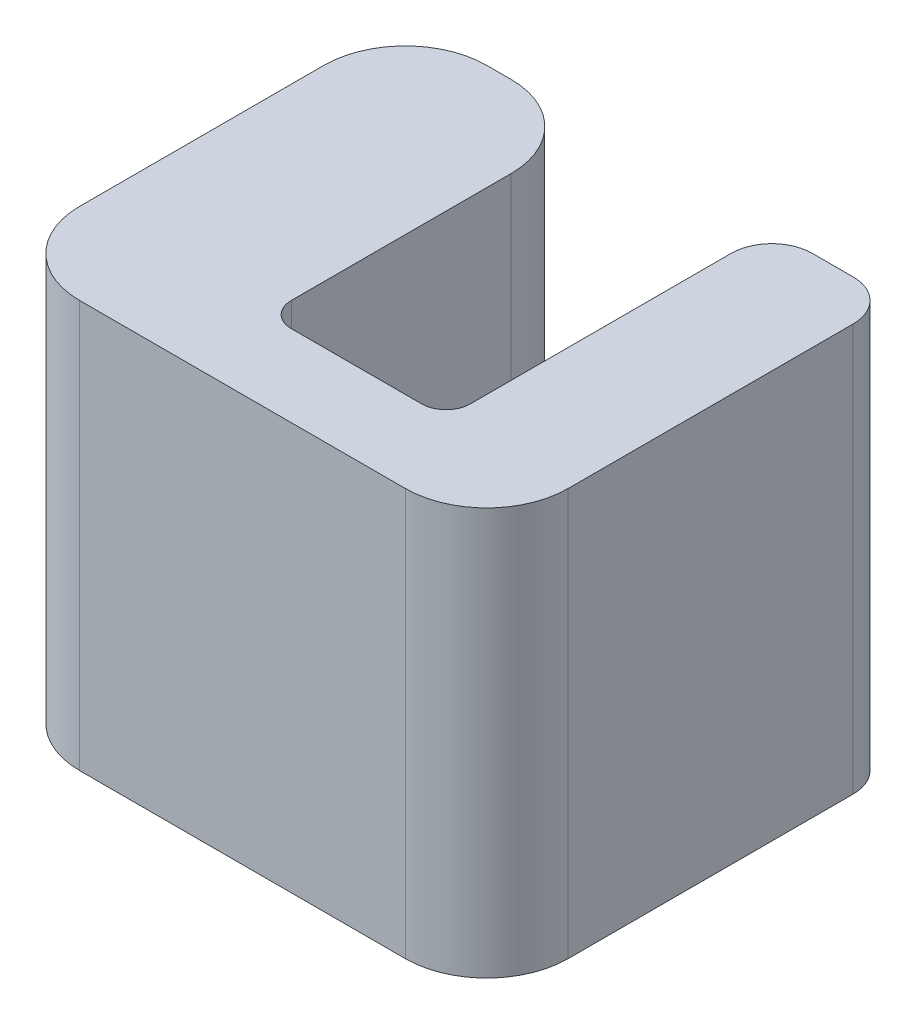
ISO-10303-21;
HEADER;
FILE_DESCRIPTION(('STEP AP214'),'2;1');
FILE_NAME('part.step','',(''),(''),'','','');
FILE_SCHEMA(('AUTOMOTIVE_DESIGN { 1 0 10303 214 1 1 1 1 }'));
ENDSEC;
DATA;
#1=APPLICATION_CONTEXT('core data for automotive mechanical design processes');
#2=APPLICATION_PROTOCOL_DEFINITION('international standard','automotive_design',2000,#1);
#3=PRODUCT_CONTEXT('',#1,'mechanical');
#4=PRODUCT('Part','Part','',(#3));
#5=PRODUCT_RELATED_PRODUCT_CATEGORY('part','',(#4));
#6=PRODUCT_DEFINITION_FORMATION('','',#4);
#7=PRODUCT_DEFINITION_CONTEXT('part definition',#1,'design');
#8=PRODUCT_DEFINITION('design','',#6,#7);
#9=PRODUCT_DEFINITION_SHAPE('','',#8);
#10=(LENGTH_UNIT() NAMED_UNIT(*) SI_UNIT(.MILLI.,.METRE.));
#11=(NAMED_UNIT(*) PLANE_ANGLE_UNIT() SI_UNIT($,.RADIAN.));
#12=(NAMED_UNIT(*) SI_UNIT($,.STERADIAN.) SOLID_ANGLE_UNIT());
#13=UNCERTAINTY_MEASURE_WITH_UNIT(LENGTH_MEASURE(1.E-05),#10,'distance_accuracy_value','');
#14=(GEOMETRIC_REPRESENTATION_CONTEXT(3) GLOBAL_UNCERTAINTY_ASSIGNED_CONTEXT((#13)) GLOBAL_UNIT_ASSIGNED_CONTEXT((#10,
#11,#12)) REPRESENTATION_CONTEXT('',''));
#15=CARTESIAN_POINT('',(0.,0.,0.));
#16=DIRECTION('',(0.,0.,1.));
#17=DIRECTION('',(1.,0.,0.));
#18=AXIS2_PLACEMENT_3D('',#15,#16,#17);
#19=CARTESIAN_POINT('',(-0.4,0.,1.2));
#20=DIRECTION('',(0.,1.,0.));
#21=DIRECTION('',(0.,0.,1.));
#22=AXIS2_PLACEMENT_3D('',#19,#20,#21);
#23=CYLINDRICAL_SURFACE('',#22,0.3);
#24=DIRECTION('',(0.,-1.,0.));
#25=VECTOR('',#24,1.);
#26=CARTESIAN_POINT('',(-0.7,0.,1.2));
#27=LINE('',#26,#25);
#28=CARTESIAN_POINT('',(-0.7,5.,1.2));
#29=VERTEX_POINT('',#28);
#30=CARTESIAN_POINT('',(-0.7,0.,1.2));
#31=VERTEX_POINT('',#30);
#32=EDGE_CURVE('E247',#29,#31,#27,.T.);
#33=ORIENTED_EDGE('',*,*,#32,.F.);
#34=CARTESIAN_POINT('',(-0.4,5.,1.2));
#35=DIRECTION('',(0.,-1.,0.));
#36=DIRECTION('',(0.,0.,-1.));
#37=AXIS2_PLACEMENT_3D('',#34,#35,#36);
#38=CIRCLE('',#37,0.3);
#39=CARTESIAN_POINT('',(-0.4,5.,1.5));
#40=VERTEX_POINT('',#39);
#41=EDGE_CURVE('E40',#29,#40,#38,.F.);
#42=ORIENTED_EDGE('',*,*,#41,.T.);
#43=DIRECTION('',(0.,-1.,0.));
#44=VECTOR('',#43,1.);
#45=CARTESIAN_POINT('',(-0.4,0.,1.5));
#46=LINE('',#45,#44);
#47=CARTESIAN_POINT('',(-0.4,0.,1.5));
#48=VERTEX_POINT('',#47);
#49=EDGE_CURVE('E250',#48,#40,#46,.F.);
#50=ORIENTED_EDGE('',*,*,#49,.F.);
#51=CARTESIAN_POINT('',(-0.4,0.,1.2));
#52=DIRECTION('',(0.,-1.,0.));
#53=DIRECTION('',(0.,0.,-1.));
#54=AXIS2_PLACEMENT_3D('',#51,#52,#53);
#55=CIRCLE('',#54,0.3);
#56=EDGE_CURVE('E11',#48,#31,#55,.T.);
#57=ORIENTED_EDGE('',*,*,#56,.T.);
#58=EDGE_LOOP('',(#33,#42,#50,#57));
#59=FACE_BOUND('',#58,.T.);
#60=ADVANCED_FACE('F33',(#59),#23,.F.);
#61=CARTESIAN_POINT('',(1.2,0.,1.2));
#62=DIRECTION('',(0.,1.,0.));
#63=DIRECTION('',(0.,0.,1.));
#64=AXIS2_PLACEMENT_3D('',#61,#62,#63);
#65=CYLINDRICAL_SURFACE('',#64,0.3);
#66=DIRECTION('',(0.,-1.,0.));
#67=VECTOR('',#66,1.);
#68=CARTESIAN_POINT('',(1.2,0.,1.5));
#69=LINE('',#68,#67);
#70=CARTESIAN_POINT('',(1.2,5.,1.5));
#71=VERTEX_POINT('',#70);
#72=CARTESIAN_POINT('',(1.2,0.,1.5));
#73=VERTEX_POINT('',#72);
#74=EDGE_CURVE('E236',#71,#73,#69,.T.);
#75=ORIENTED_EDGE('',*,*,#74,.F.);
#76=CARTESIAN_POINT('',(1.2,5.,1.2));
#77=DIRECTION('',(0.,-1.,0.));
#78=DIRECTION('',(0.,0.,-1.));
#79=AXIS2_PLACEMENT_3D('',#76,#77,#78);
#80=CIRCLE('',#79,0.3);
#81=CARTESIAN_POINT('',(1.5,5.,1.2));
#82=VERTEX_POINT('',#81);
#83=EDGE_CURVE('E242',#71,#82,#80,.F.);
#84=ORIENTED_EDGE('',*,*,#83,.T.);
#85=DIRECTION('',(0.,-1.,0.));
#86=VECTOR('',#85,1.);
#87=CARTESIAN_POINT('',(1.5,0.,1.2));
#88=LINE('',#87,#86);
#89=CARTESIAN_POINT('',(1.5,0.,1.2));
#90=VERTEX_POINT('',#89);
#91=EDGE_CURVE('E239',#90,#82,#88,.F.);
#92=ORIENTED_EDGE('',*,*,#91,.F.);
#93=CARTESIAN_POINT('',(1.2,0.,1.2));
#94=DIRECTION('',(0.,-1.,0.));
#95=DIRECTION('',(0.,0.,-1.));
#96=AXIS2_PLACEMENT_3D('',#93,#94,#95);
#97=CIRCLE('',#96,0.3);
#98=EDGE_CURVE('E244',#90,#73,#97,.T.);
#99=ORIENTED_EDGE('',*,*,#98,.T.);
#100=EDGE_LOOP('',(#75,#84,#92,#99));
#101=FACE_BOUND('',#100,.T.);
#102=ADVANCED_FACE('F306',(#101),#65,.F.);
#103=CARTESIAN_POINT('',(2.5,5.,-2.));
#104=DIRECTION('',(0.,-1.,0.));
#105=DIRECTION('',(0.,0.,-1.));
#106=AXIS2_PLACEMENT_3D('',#103,#104,#105);
#107=CYLINDRICAL_SURFACE('',#106,0.5);
#108=DIRECTION('',(0.,-1.,0.));
#109=VECTOR('',#108,1.);
#110=CARTESIAN_POINT('',(2.5,5.,-2.5));
#111=LINE('',#110,#109);
#112=CARTESIAN_POINT('',(2.5,5.,-2.5));
#113=VERTEX_POINT('',#112);
#114=CARTESIAN_POINT('',(2.5,0.,-2.5));
#115=VERTEX_POINT('',#114);
#116=EDGE_CURVE('E228',#113,#115,#111,.T.);
#117=ORIENTED_EDGE('',*,*,#116,.F.);
#118=CARTESIAN_POINT('',(2.5,5.,-2.));
#119=DIRECTION('',(0.,-1.,0.));
#120=DIRECTION('',(0.,0.,-1.));
#121=AXIS2_PLACEMENT_3D('',#118,#119,#120);
#122=CIRCLE('',#121,0.5);
#123=CARTESIAN_POINT('',(3.,5.,-2.));
#124=VERTEX_POINT('',#123);
#125=EDGE_CURVE('E233',#124,#113,#122,.F.);
#126=ORIENTED_EDGE('',*,*,#125,.F.);
#127=DIRECTION('',(0.,-1.,0.));
#128=VECTOR('',#127,1.);
#129=CARTESIAN_POINT('',(3.,5.,-2.));
#130=LINE('',#129,#128);
#131=CARTESIAN_POINT('',(3.,0.,-2.));
#132=VERTEX_POINT('',#131);
#133=EDGE_CURVE('E231',#132,#124,#130,.F.);
#134=ORIENTED_EDGE('',*,*,#133,.F.);
#135=CARTESIAN_POINT('',(2.5,0.,-2.));
#136=DIRECTION('',(0.,-1.,0.));
#137=DIRECTION('',(0.,0.,-1.));
#138=AXIS2_PLACEMENT_3D('',#135,#136,#137);
#139=CIRCLE('',#138,0.5);
#140=EDGE_CURVE('E167',#115,#132,#139,.T.);
#141=ORIENTED_EDGE('',*,*,#140,.F.);
#142=EDGE_LOOP('',(#117,#126,#134,#141));
#143=FACE_BOUND('',#142,.T.);
#144=ADVANCED_FACE('F321',(#143),#107,.T.);
#145=CARTESIAN_POINT('',(2.,5.,-2.));
#146=DIRECTION('',(0.,1.,0.));
#147=DIRECTION('',(0.,0.,1.));
#148=AXIS2_PLACEMENT_3D('',#145,#146,#147);
#149=CYLINDRICAL_SURFACE('',#148,0.5);
#150=DIRECTION('',(0.,1.,0.));
#151=VECTOR('',#150,1.);
#152=CARTESIAN_POINT('',(2.,5.,-2.5));
#153=LINE('',#152,#151);
#154=CARTESIAN_POINT('',(2.,0.,-2.5));
#155=VERTEX_POINT('',#154);
#156=CARTESIAN_POINT('',(2.,5.,-2.5));
#157=VERTEX_POINT('',#156);
#158=EDGE_CURVE('E216',#155,#157,#153,.T.);
#159=ORIENTED_EDGE('',*,*,#158,.F.);
#160=CARTESIAN_POINT('',(2.,0.,-2.));
#161=DIRECTION('',(0.,-1.,0.));
#162=DIRECTION('',(0.,0.,-1.));
#163=AXIS2_PLACEMENT_3D('',#160,#161,#162);
#164=CIRCLE('',#163,0.5);
#165=CARTESIAN_POINT('',(1.5,0.,-2.));
#166=VERTEX_POINT('',#165);
#167=EDGE_CURVE('E222',#166,#155,#164,.T.);
#168=ORIENTED_EDGE('',*,*,#167,.F.);
#169=DIRECTION('',(0.,1.,0.));
#170=VECTOR('',#169,1.);
#171=CARTESIAN_POINT('',(1.5,0.,-2.));
#172=LINE('',#171,#170);
#173=CARTESIAN_POINT('',(1.5,5.,-2.));
#174=VERTEX_POINT('',#173);
#175=EDGE_CURVE('E219',#174,#166,#172,.F.);
#176=ORIENTED_EDGE('',*,*,#175,.F.);
#177=CARTESIAN_POINT('',(2.,5.,-2.));
#178=DIRECTION('',(0.,-1.,0.));
#179=DIRECTION('',(0.,0.,-1.));
#180=AXIS2_PLACEMENT_3D('',#177,#178,#179);
#181=CIRCLE('',#180,0.5);
#182=EDGE_CURVE('E225',#157,#174,#181,.F.);
#183=ORIENTED_EDGE('',*,*,#182,.F.);
#184=EDGE_LOOP('',(#159,#168,#176,#183));
#185=FACE_BOUND('',#184,.T.);
#186=ADVANCED_FACE('F314',(#185),#149,.T.);
#187=CARTESIAN_POINT('',(-1.7,5.,-1.5));
#188=DIRECTION('',(0.,-1.,0.));
#189=DIRECTION('',(0.,0.,-1.));
#190=AXIS2_PLACEMENT_3D('',#187,#188,#189);
#191=CYLINDRICAL_SURFACE('',#190,1.);
#192=DIRECTION('',(0.,-1.,0.));
#193=VECTOR('',#192,1.);
#194=CARTESIAN_POINT('',(-1.7,5.,-2.5));
#195=LINE('',#194,#193);
#196=CARTESIAN_POINT('',(-1.7,5.,-2.5));
#197=VERTEX_POINT('',#196);
#198=CARTESIAN_POINT('',(-1.7,0.,-2.5));
#199=VERTEX_POINT('',#198);
#200=EDGE_CURVE('E206',#197,#199,#195,.T.);
#201=ORIENTED_EDGE('',*,*,#200,.F.);
#202=CARTESIAN_POINT('',(-1.7,5.,-1.5));
#203=DIRECTION('',(0.,-1.,0.));
#204=DIRECTION('',(0.,0.,-1.));
#205=AXIS2_PLACEMENT_3D('',#202,#203,#204);
#206=CIRCLE('',#205,1.);
#207=CARTESIAN_POINT('',(-0.7,5.,-1.5));
#208=VERTEX_POINT('',#207);
#209=EDGE_CURVE('E212',#208,#197,#206,.F.);
#210=ORIENTED_EDGE('',*,*,#209,.F.);
#211=DIRECTION('',(0.,-1.,0.));
#212=VECTOR('',#211,1.);
#213=CARTESIAN_POINT('',(-0.7,0.,-1.5));
#214=LINE('',#213,#212);
#215=CARTESIAN_POINT('',(-0.7,0.,-1.5));
#216=VERTEX_POINT('',#215);
#217=EDGE_CURVE('E209',#216,#208,#214,.F.);
#218=ORIENTED_EDGE('',*,*,#217,.F.);
#219=CARTESIAN_POINT('',(-1.7,0.,-1.5));
#220=DIRECTION('',(0.,-1.,0.));
#221=DIRECTION('',(0.,0.,-1.));
#222=AXIS2_PLACEMENT_3D('',#219,#220,#221);
#223=CIRCLE('',#222,1.);
#224=EDGE_CURVE('E214',#199,#216,#223,.T.);
#225=ORIENTED_EDGE('',*,*,#224,.F.);
#226=EDGE_LOOP('',(#201,#210,#218,#225));
#227=FACE_BOUND('',#226,.T.);
#228=ADVANCED_FACE('F298',(#227),#191,.T.);
#229=CARTESIAN_POINT('',(-2.,5.,-1.5));
#230=DIRECTION('',(0.,1.,0.));
#231=DIRECTION('',(0.,0.,1.));
#232=AXIS2_PLACEMENT_3D('',#229,#230,#231);
#233=CYLINDRICAL_SURFACE('',#232,1.);
#234=DIRECTION('',(0.,1.,0.));
#235=VECTOR('',#234,1.);
#236=CARTESIAN_POINT('',(-2.,5.,-2.5));
#237=LINE('',#236,#235);
#238=CARTESIAN_POINT('',(-2.,0.,-2.5));
#239=VERTEX_POINT('',#238);
#240=CARTESIAN_POINT('',(-2.,5.,-2.5));
#241=VERTEX_POINT('',#240);
#242=EDGE_CURVE('E195',#239,#241,#237,.T.);
#243=ORIENTED_EDGE('',*,*,#242,.F.);
#244=CARTESIAN_POINT('',(-2.,0.,-1.5));
#245=DIRECTION('',(0.,-1.,0.));
#246=DIRECTION('',(0.,0.,-1.));
#247=AXIS2_PLACEMENT_3D('',#244,#245,#246);
#248=CIRCLE('',#247,1.);
#249=CARTESIAN_POINT('',(-3.,0.,-1.5));
#250=VERTEX_POINT('',#249);
#251=EDGE_CURVE('E201',#250,#239,#248,.T.);
#252=ORIENTED_EDGE('',*,*,#251,.F.);
#253=DIRECTION('',(0.,1.,0.));
#254=VECTOR('',#253,1.);
#255=CARTESIAN_POINT('',(-3.,5.,-1.5));
#256=LINE('',#255,#254);
#257=CARTESIAN_POINT('',(-3.,5.,-1.5));
#258=VERTEX_POINT('',#257);
#259=EDGE_CURVE('E198',#258,#250,#256,.F.);
#260=ORIENTED_EDGE('',*,*,#259,.F.);
#261=CARTESIAN_POINT('',(-2.,5.,-1.5));
#262=DIRECTION('',(0.,-1.,0.));
#263=DIRECTION('',(0.,0.,-1.));
#264=AXIS2_PLACEMENT_3D('',#261,#262,#263);
#265=CIRCLE('',#264,1.);
#266=EDGE_CURVE('E204',#241,#258,#265,.F.);
#267=ORIENTED_EDGE('',*,*,#266,.F.);
#268=EDGE_LOOP('',(#243,#252,#260,#267));
#269=FACE_BOUND('',#268,.T.);
#270=ADVANCED_FACE('F290',(#269),#233,.T.);
#271=CARTESIAN_POINT('',(-2.,5.,1.5));
#272=DIRECTION('',(0.,1.,0.));
#273=DIRECTION('',(0.,0.,1.));
#274=AXIS2_PLACEMENT_3D('',#271,#272,#273);
#275=CYLINDRICAL_SURFACE('',#274,1.);
#276=DIRECTION('',(0.,1.,0.));
#277=VECTOR('',#276,1.);
#278=CARTESIAN_POINT('',(-3.,5.,1.5));
#279=LINE('',#278,#277);
#280=CARTESIAN_POINT('',(-3.,0.,1.5));
#281=VERTEX_POINT('',#280);
#282=CARTESIAN_POINT('',(-3.,5.,1.5));
#283=VERTEX_POINT('',#282);
#284=EDGE_CURVE('E153',#281,#283,#279,.T.);
#285=ORIENTED_EDGE('',*,*,#284,.F.);
#286=CARTESIAN_POINT('',(-2.,0.,1.5));
#287=DIRECTION('',(0.,-1.,0.));
#288=DIRECTION('',(0.,0.,-1.));
#289=AXIS2_PLACEMENT_3D('',#286,#287,#288);
#290=CIRCLE('',#289,1.);
#291=CARTESIAN_POINT('',(-2.,0.,2.5));
#292=VERTEX_POINT('',#291);
#293=EDGE_CURVE('E190',#292,#281,#290,.T.);
#294=ORIENTED_EDGE('',*,*,#293,.F.);
#295=DIRECTION('',(0.,1.,0.));
#296=VECTOR('',#295,1.);
#297=CARTESIAN_POINT('',(-2.,5.,2.5));
#298=LINE('',#297,#296);
#299=CARTESIAN_POINT('',(-2.,5.,2.5));
#300=VERTEX_POINT('',#299);
#301=EDGE_CURVE('E187',#300,#292,#298,.F.);
#302=ORIENTED_EDGE('',*,*,#301,.F.);
#303=CARTESIAN_POINT('',(-2.,5.,1.5));
#304=DIRECTION('',(0.,-1.,0.));
#305=DIRECTION('',(0.,0.,-1.));
#306=AXIS2_PLACEMENT_3D('',#303,#304,#305);
#307=CIRCLE('',#306,1.);
#308=EDGE_CURVE('E193',#283,#300,#307,.F.);
#309=ORIENTED_EDGE('',*,*,#308,.F.);
#310=EDGE_LOOP('',(#285,#294,#302,#309));
#311=FACE_BOUND('',#310,.T.);
#312=ADVANCED_FACE('F283',(#311),#275,.T.);
#313=CARTESIAN_POINT('',(2.,5.,1.5));
#314=DIRECTION('',(0.,-1.,0.));
#315=DIRECTION('',(0.,0.,-1.));
#316=AXIS2_PLACEMENT_3D('',#313,#314,#315);
#317=CYLINDRICAL_SURFACE('',#316,1.);
#318=DIRECTION('',(0.,-1.,0.));
#319=VECTOR('',#318,1.);
#320=CARTESIAN_POINT('',(3.,5.,1.5));
#321=LINE('',#320,#319);
#322=CARTESIAN_POINT('',(3.,5.,1.5));
#323=VERTEX_POINT('',#322);
#324=CARTESIAN_POINT('',(3.,0.,1.5));
#325=VERTEX_POINT('',#324);
#326=EDGE_CURVE('E147',#323,#325,#321,.T.);
#327=ORIENTED_EDGE('',*,*,#326,.F.);
#328=CARTESIAN_POINT('',(2.,5.,1.5));
#329=DIRECTION('',(0.,-1.,0.));
#330=DIRECTION('',(0.,0.,-1.));
#331=AXIS2_PLACEMENT_3D('',#328,#329,#330);
#332=CIRCLE('',#331,1.);
#333=CARTESIAN_POINT('',(2.,5.,2.5));
#334=VERTEX_POINT('',#333);
#335=EDGE_CURVE('E154',#334,#323,#332,.F.);
#336=ORIENTED_EDGE('',*,*,#335,.F.);
#337=DIRECTION('',(0.,-1.,0.));
#338=VECTOR('',#337,1.);
#339=CARTESIAN_POINT('',(2.,5.,2.5));
#340=LINE('',#339,#338);
#341=CARTESIAN_POINT('',(2.,0.,2.5));
#342=VERTEX_POINT('',#341);
#343=EDGE_CURVE('E150',#342,#334,#340,.F.);
#344=ORIENTED_EDGE('',*,*,#343,.F.);
#345=CARTESIAN_POINT('',(2.,0.,1.5));
#346=DIRECTION('',(0.,-1.,0.));
#347=DIRECTION('',(0.,0.,-1.));
#348=AXIS2_PLACEMENT_3D('',#345,#346,#347);
#349=CIRCLE('',#348,1.);
#350=EDGE_CURVE('E143',#325,#342,#349,.T.);
#351=ORIENTED_EDGE('',*,*,#350,.F.);
#352=EDGE_LOOP('',(#327,#336,#344,#351));
#353=FACE_BOUND('',#352,.T.);
#354=ADVANCED_FACE('F145',(#353),#317,.T.);
#355=CARTESIAN_POINT('',(-3.,5.,-2.5));
#356=DIRECTION('',(0.,0.,1.));
#357=DIRECTION('',(1.,0.,0.));
#358=AXIS2_PLACEMENT_3D('',#355,#356,#357);
#359=PLANE('',#358);
#360=DIRECTION('',(-1.,0.,0.));
#361=VECTOR('',#360,1.);
#362=CARTESIAN_POINT('',(-3.,5.,-2.5));
#363=LINE('',#362,#361);
#364=EDGE_CURVE('E271',#197,#241,#363,.T.);
#365=ORIENTED_EDGE('',*,*,#364,.F.);
#366=ORIENTED_EDGE('',*,*,#200,.T.);
#367=DIRECTION('',(-1.,0.,0.));
#368=VECTOR('',#367,1.);
#369=CARTESIAN_POINT('',(-3.,0.,-2.5));
#370=LINE('',#369,#368);
#371=EDGE_CURVE('E169',#199,#239,#370,.T.);
#372=ORIENTED_EDGE('',*,*,#371,.T.);
#373=ORIENTED_EDGE('',*,*,#242,.T.);
#374=EDGE_LOOP('',(#365,#366,#372,#373));
#375=FACE_BOUND('',#374,.T.);
#376=ADVANCED_FACE('F295',(#375),#359,.F.);
#377=CARTESIAN_POINT('',(3.,5.,2.5));
#378=DIRECTION('',(-1.,0.,0.));
#379=DIRECTION('',(0.,0.,1.));
#380=AXIS2_PLACEMENT_3D('',#377,#378,#379);
#381=PLANE('',#380);
#382=DIRECTION('',(0.,0.,-1.));
#383=VECTOR('',#382,1.);
#384=CARTESIAN_POINT('',(3.,0.,2.5));
#385=LINE('',#384,#383);
#386=EDGE_CURVE('E160',#325,#132,#385,.T.);
#387=ORIENTED_EDGE('',*,*,#386,.T.);
#388=ORIENTED_EDGE('',*,*,#133,.T.);
#389=DIRECTION('',(0.,0.,-1.));
#390=VECTOR('',#389,1.);
#391=CARTESIAN_POINT('',(3.,5.,2.5));
#392=LINE('',#391,#390);
#393=EDGE_CURVE('E162',#323,#124,#392,.T.);
#394=ORIENTED_EDGE('',*,*,#393,.F.);
#395=ORIENTED_EDGE('',*,*,#326,.T.);
#396=EDGE_LOOP('',(#387,#388,#394,#395));
#397=FACE_BOUND('',#396,.T.);
#398=ADVANCED_FACE('F158',(#397),#381,.F.);
#399=EDGE_CURVE('E272',#113,#157,#363,.T.);
#400=ORIENTED_EDGE('',*,*,#399,.F.);
#401=ORIENTED_EDGE('',*,*,#116,.T.);
#402=EDGE_CURVE('E172',#115,#155,#370,.T.);
#403=ORIENTED_EDGE('',*,*,#402,.T.);
#404=ORIENTED_EDGE('',*,*,#158,.T.);
#405=EDGE_LOOP('',(#400,#401,#403,#404));
#406=FACE_BOUND('',#405,.T.);
#407=ADVANCED_FACE('F318',(#406),#359,.F.);
#408=CARTESIAN_POINT('',(-3.,5.,2.5));
#409=DIRECTION('',(1.,0.,0.));
#410=DIRECTION('',(0.,0.,-1.));
#411=AXIS2_PLACEMENT_3D('',#408,#409,#410);
#412=PLANE('',#411);
#413=DIRECTION('',(0.,0.,1.));
#414=VECTOR('',#413,1.);
#415=CARTESIAN_POINT('',(-3.,5.,2.5));
#416=LINE('',#415,#414);
#417=EDGE_CURVE('E273',#258,#283,#416,.T.);
#418=ORIENTED_EDGE('',*,*,#417,.F.);
#419=ORIENTED_EDGE('',*,*,#259,.T.);
#420=DIRECTION('',(0.,0.,1.));
#421=VECTOR('',#420,1.);
#422=CARTESIAN_POINT('',(-3.,0.,2.5));
#423=LINE('',#422,#421);
#424=EDGE_CURVE('E179',#250,#281,#423,.T.);
#425=ORIENTED_EDGE('',*,*,#424,.T.);
#426=ORIENTED_EDGE('',*,*,#284,.T.);
#427=EDGE_LOOP('',(#418,#419,#425,#426));
#428=FACE_BOUND('',#427,.T.);
#429=ADVANCED_FACE('F285',(#428),#412,.F.);
#430=CARTESIAN_POINT('',(-3.,5.,2.5));
#431=DIRECTION('',(0.,0.,-1.));
#432=DIRECTION('',(-1.,0.,0.));
#433=AXIS2_PLACEMENT_3D('',#430,#431,#432);
#434=PLANE('',#433);
#435=DIRECTION('',(1.,0.,0.));
#436=VECTOR('',#435,1.);
#437=CARTESIAN_POINT('',(-3.,5.,2.5));
#438=LINE('',#437,#436);
#439=EDGE_CURVE('E163',#300,#334,#438,.T.);
#440=ORIENTED_EDGE('',*,*,#439,.F.);
#441=ORIENTED_EDGE('',*,*,#301,.T.);
#442=DIRECTION('',(1.,0.,0.));
#443=VECTOR('',#442,1.);
#444=CARTESIAN_POINT('',(-3.,0.,2.5));
#445=LINE('',#444,#443);
#446=EDGE_CURVE('E181',#292,#342,#445,.T.);
#447=ORIENTED_EDGE('',*,*,#446,.T.);
#448=ORIENTED_EDGE('',*,*,#343,.T.);
#449=EDGE_LOOP('',(#440,#441,#447,#448));
#450=FACE_BOUND('',#449,.T.);
#451=ADVANCED_FACE('F279',(#450),#434,.F.);
#452=CARTESIAN_POINT('',(0.,5.,0.));
#453=DIRECTION('',(0.,-1.,0.));
#454=DIRECTION('',(0.,0.,-1.));
#455=AXIS2_PLACEMENT_3D('',#452,#453,#454);
#456=PLANE('',#455);
#457=ORIENTED_EDGE('',*,*,#393,.T.);
#458=ORIENTED_EDGE('',*,*,#125,.T.);
#459=ORIENTED_EDGE('',*,*,#399,.T.);
#460=ORIENTED_EDGE('',*,*,#182,.T.);
#461=DIRECTION('',(0.,0.,-1.));
#462=VECTOR('',#461,1.);
#463=CARTESIAN_POINT('',(1.5,5.,-2.5));
#464=LINE('',#463,#462);
#465=EDGE_CURVE('E262',#82,#174,#464,.T.);
#466=ORIENTED_EDGE('',*,*,#465,.F.);
#467=ORIENTED_EDGE('',*,*,#83,.F.);
#468=DIRECTION('',(1.,0.,0.));
#469=VECTOR('',#468,1.);
#470=CARTESIAN_POINT('',(-0.7,5.,1.5));
#471=LINE('',#470,#469);
#472=EDGE_CURVE('E255',#40,#71,#471,.T.);
#473=ORIENTED_EDGE('',*,*,#472,.F.);
#474=ORIENTED_EDGE('',*,*,#41,.F.);
#475=DIRECTION('',(0.,0.,1.));
#476=VECTOR('',#475,1.);
#477=CARTESIAN_POINT('',(-0.700000000000001,5.,-2.5));
#478=LINE('',#477,#476);
#479=EDGE_CURVE('E263',#208,#29,#478,.T.);
#480=ORIENTED_EDGE('',*,*,#479,.F.);
#481=ORIENTED_EDGE('',*,*,#209,.T.);
#482=ORIENTED_EDGE('',*,*,#364,.T.);
#483=ORIENTED_EDGE('',*,*,#266,.T.);
#484=ORIENTED_EDGE('',*,*,#417,.T.);
#485=ORIENTED_EDGE('',*,*,#308,.T.);
#486=ORIENTED_EDGE('',*,*,#439,.T.);
#487=ORIENTED_EDGE('',*,*,#335,.T.);
#488=EDGE_LOOP('',(#457,#458,#459,#460,#466,#467,#473,#474,#480,#481,#482,#483,#484,#485,#486,#487));
#489=FACE_BOUND('',#488,.T.);
#490=ADVANCED_FACE('F258',(#489),#456,.F.);
#491=CARTESIAN_POINT('',(0.,0.,0.));
#492=DIRECTION('',(0.,-1.,0.));
#493=DIRECTION('',(0.,0.,-1.));
#494=AXIS2_PLACEMENT_3D('',#491,#492,#493);
#495=PLANE('',#494);
#496=ORIENTED_EDGE('',*,*,#56,.F.);
#497=DIRECTION('',(1.,0.,0.));
#498=VECTOR('',#497,1.);
#499=CARTESIAN_POINT('',(-0.7,0.,1.5));
#500=LINE('',#499,#498);
#501=EDGE_CURVE('E174',#48,#73,#500,.T.);
#502=ORIENTED_EDGE('',*,*,#501,.T.);
#503=ORIENTED_EDGE('',*,*,#98,.F.);
#504=DIRECTION('',(0.,0.,-1.));
#505=VECTOR('',#504,1.);
#506=CARTESIAN_POINT('',(1.5,0.,-2.5));
#507=LINE('',#506,#505);
#508=EDGE_CURVE('E170',#90,#166,#507,.T.);
#509=ORIENTED_EDGE('',*,*,#508,.T.);
#510=ORIENTED_EDGE('',*,*,#167,.T.);
#511=ORIENTED_EDGE('',*,*,#402,.F.);
#512=ORIENTED_EDGE('',*,*,#140,.T.);
#513=ORIENTED_EDGE('',*,*,#386,.F.);
#514=ORIENTED_EDGE('',*,*,#350,.T.);
#515=ORIENTED_EDGE('',*,*,#446,.F.);
#516=ORIENTED_EDGE('',*,*,#293,.T.);
#517=ORIENTED_EDGE('',*,*,#424,.F.);
#518=ORIENTED_EDGE('',*,*,#251,.T.);
#519=ORIENTED_EDGE('',*,*,#371,.F.);
#520=ORIENTED_EDGE('',*,*,#224,.T.);
#521=DIRECTION('',(0.,0.,1.));
#522=VECTOR('',#521,1.);
#523=CARTESIAN_POINT('',(-0.700000000000001,0.,-2.5));
#524=LINE('',#523,#522);
#525=EDGE_CURVE('E265',#216,#31,#524,.T.);
#526=ORIENTED_EDGE('',*,*,#525,.T.);
#527=EDGE_LOOP('',(#496,#502,#503,#509,#510,#511,#512,#513,#514,#515,#516,#517,#518,#519,#520,#526));
#528=FACE_BOUND('',#527,.T.);
#529=ADVANCED_FACE('F165',(#528),#495,.T.);
#530=CARTESIAN_POINT('',(-0.700000000000001,0.,-2.5));
#531=DIRECTION('',(-1.,0.,0.));
#532=DIRECTION('',(0.,0.,1.));
#533=AXIS2_PLACEMENT_3D('',#530,#531,#532);
#534=PLANE('',#533);
#535=ORIENTED_EDGE('',*,*,#479,.T.);
#536=ORIENTED_EDGE('',*,*,#32,.T.);
#537=ORIENTED_EDGE('',*,*,#525,.F.);
#538=ORIENTED_EDGE('',*,*,#217,.T.);
#539=EDGE_LOOP('',(#535,#536,#537,#538));
#540=FACE_BOUND('',#539,.T.);
#541=ADVANCED_FACE('F301',(#540),#534,.F.);
#542=CARTESIAN_POINT('',(1.5,0.,-2.5));
#543=DIRECTION('',(1.,0.,0.));
#544=DIRECTION('',(0.,0.,-1.));
#545=AXIS2_PLACEMENT_3D('',#542,#543,#544);
#546=PLANE('',#545);
#547=ORIENTED_EDGE('',*,*,#508,.F.);
#548=ORIENTED_EDGE('',*,*,#91,.T.);
#549=ORIENTED_EDGE('',*,*,#465,.T.);
#550=ORIENTED_EDGE('',*,*,#175,.T.);
#551=EDGE_LOOP('',(#547,#548,#549,#550));
#552=FACE_BOUND('',#551,.T.);
#553=ADVANCED_FACE('F309',(#552),#546,.F.);
#554=CARTESIAN_POINT('',(-0.7,0.,1.5));
#555=DIRECTION('',(0.,0.,1.));
#556=DIRECTION('',(1.,0.,0.));
#557=AXIS2_PLACEMENT_3D('',#554,#555,#556);
#558=PLANE('',#557);
#559=ORIENTED_EDGE('',*,*,#501,.F.);
#560=ORIENTED_EDGE('',*,*,#49,.T.);
#561=ORIENTED_EDGE('',*,*,#472,.T.);
#562=ORIENTED_EDGE('',*,*,#74,.T.);
#563=EDGE_LOOP('',(#559,#560,#561,#562));
#564=FACE_BOUND('',#563,.T.);
#565=ADVANCED_FACE('F254',(#564),#558,.F.);
#566=CLOSED_SHELL('',(#60,#102,#144,#186,#228,#270,#312,#354,#376,#398,#407,#429,#451,#490,#529,
#541,#553,#565));
#567=MANIFOLD_SOLID_BREP('B2',#566);
#568=ADVANCED_BREP_SHAPE_REPRESENTATION('',(#18,#567),#14);
#569=SHAPE_DEFINITION_REPRESENTATION(#9,#568);
ENDSEC;
END-ISO-10303-21;
